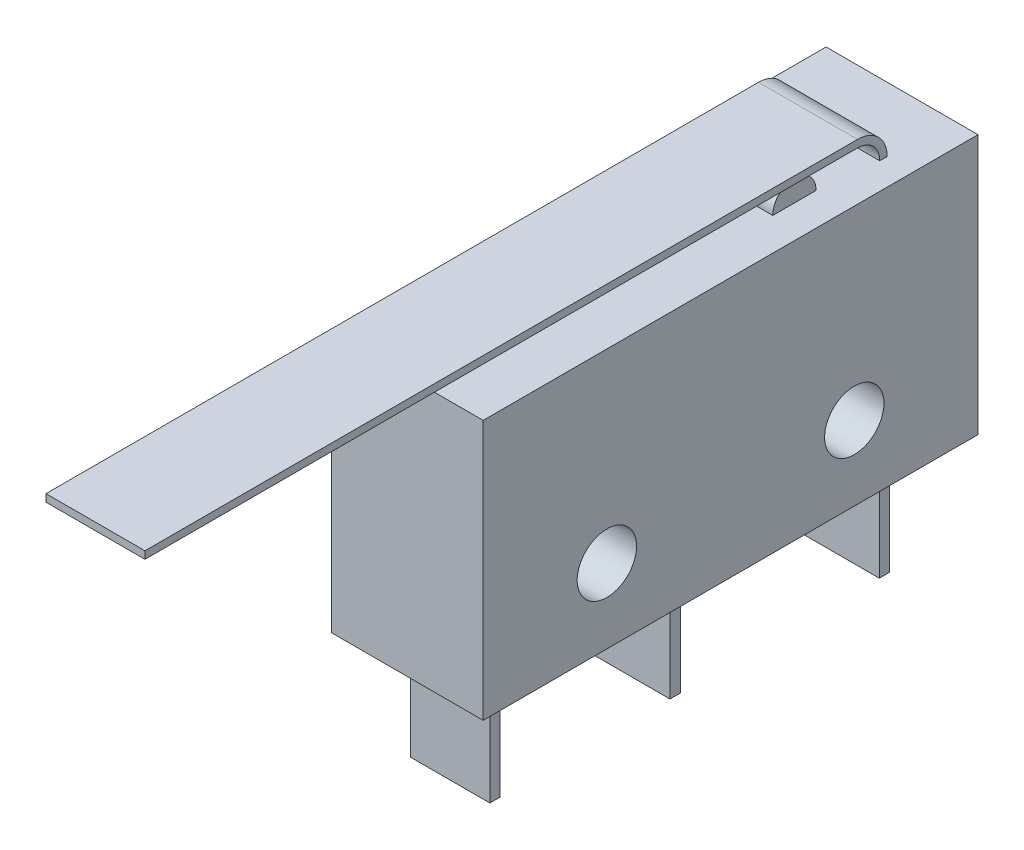
ISO-10303-21;
HEADER;
FILE_DESCRIPTION(('STEP AP214'),'2;1');
FILE_NAME('part.step','',(''),(''),'','','');
FILE_SCHEMA(('AUTOMOTIVE_DESIGN { 1 0 10303 214 1 1 1 1 }'));
ENDSEC;
DATA;
#1=APPLICATION_CONTEXT('core data for automotive mechanical design processes');
#2=APPLICATION_PROTOCOL_DEFINITION('international standard','automotive_design',2000,#1);
#3=PRODUCT_CONTEXT('',#1,'mechanical');
#4=PRODUCT('Part','Part','',(#3));
#5=PRODUCT_RELATED_PRODUCT_CATEGORY('part','',(#4));
#6=PRODUCT_DEFINITION_FORMATION('','',#4);
#7=PRODUCT_DEFINITION_CONTEXT('part definition',#1,'design');
#8=PRODUCT_DEFINITION('design','',#6,#7);
#9=PRODUCT_DEFINITION_SHAPE('','',#8);
#10=(LENGTH_UNIT() NAMED_UNIT(*) SI_UNIT(.MILLI.,.METRE.));
#11=(NAMED_UNIT(*) PLANE_ANGLE_UNIT() SI_UNIT($,.RADIAN.));
#12=(NAMED_UNIT(*) SI_UNIT($,.STERADIAN.) SOLID_ANGLE_UNIT());
#13=UNCERTAINTY_MEASURE_WITH_UNIT(LENGTH_MEASURE(1.E-05),#10,'distance_accuracy_value','');
#14=(GEOMETRIC_REPRESENTATION_CONTEXT(3) GLOBAL_UNCERTAINTY_ASSIGNED_CONTEXT((#13)) GLOBAL_UNIT_ASSIGNED_CONTEXT((#10,
#11,#12)) REPRESENTATION_CONTEXT('',''));
#15=CARTESIAN_POINT('',(0.,0.,0.));
#16=DIRECTION('',(0.,0.,1.));
#17=DIRECTION('',(1.,0.,0.));
#18=AXIS2_PLACEMENT_3D('',#15,#16,#17);
#19=CARTESIAN_POINT('',(6.14,-10.5,0.));
#20=DIRECTION('',(0.,1.,0.));
#21=DIRECTION('',(0.,0.,1.));
#22=AXIS2_PLACEMENT_3D('',#19,#20,#21);
#23=PLANE('',#22);
#24=DIRECTION('',(-1.,0.,0.));
#25=VECTOR('',#24,1.);
#26=CARTESIAN_POINT('',(4.67,-10.5,-17.48));
#27=LINE('',#26,#25);
#28=CARTESIAN_POINT('',(4.67,-10.5,-17.48));
#29=VERTEX_POINT('',#28);
#30=CARTESIAN_POINT('',(1.47,-10.5,-17.48));
#31=VERTEX_POINT('',#30);
#32=EDGE_CURVE('E48',#29,#31,#27,.T.);
#33=ORIENTED_EDGE('',*,*,#32,.F.);
#34=DIRECTION('',(0.,0.,1.));
#35=VECTOR('',#34,1.);
#36=CARTESIAN_POINT('',(4.67,-10.5,-17.48));
#37=LINE('',#36,#35);
#38=CARTESIAN_POINT('',(4.67,-10.5,-17.9));
#39=VERTEX_POINT('',#38);
#40=EDGE_CURVE('E52',#39,#29,#37,.T.);
#41=ORIENTED_EDGE('',*,*,#40,.F.);
#42=DIRECTION('',(-1.,0.,0.));
#43=VECTOR('',#42,1.);
#44=CARTESIAN_POINT('',(4.67,-10.5,-17.9));
#45=LINE('',#44,#43);
#46=CARTESIAN_POINT('',(1.47,-10.5,-17.9));
#47=VERTEX_POINT('',#46);
#48=EDGE_CURVE('E218',#39,#47,#45,.T.);
#49=ORIENTED_EDGE('',*,*,#48,.T.);
#50=DIRECTION('',(0.,0.,1.));
#51=VECTOR('',#50,1.);
#52=CARTESIAN_POINT('',(1.47,-10.5,-17.48));
#53=LINE('',#52,#51);
#54=EDGE_CURVE('E208',#47,#31,#53,.T.);
#55=ORIENTED_EDGE('',*,*,#54,.T.);
#56=EDGE_LOOP('',(#33,#41,#49,#55));
#57=FACE_BOUND('',#56,.T.);
#58=DIRECTION('',(-1.,0.,0.));
#59=VECTOR('',#58,1.);
#60=CARTESIAN_POINT('',(4.67,-10.5,-9.02));
#61=LINE('',#60,#59);
#62=CARTESIAN_POINT('',(4.67,-10.5,-9.02));
#63=VERTEX_POINT('',#62);
#64=CARTESIAN_POINT('',(1.47,-10.5,-9.02));
#65=VERTEX_POINT('',#64);
#66=EDGE_CURVE('E233',#63,#65,#61,.T.);
#67=ORIENTED_EDGE('',*,*,#66,.F.);
#68=DIRECTION('',(0.,0.,1.));
#69=VECTOR('',#68,1.);
#70=CARTESIAN_POINT('',(4.67,-10.5,-9.02));
#71=LINE('',#70,#69);
#72=CARTESIAN_POINT('',(4.67,-10.5,-9.44));
#73=VERTEX_POINT('',#72);
#74=EDGE_CURVE('E231',#73,#63,#71,.T.);
#75=ORIENTED_EDGE('',*,*,#74,.F.);
#76=DIRECTION('',(-1.,0.,0.));
#77=VECTOR('',#76,1.);
#78=CARTESIAN_POINT('',(4.67,-10.5,-9.44));
#79=LINE('',#78,#77);
#80=CARTESIAN_POINT('',(1.47,-10.5,-9.44));
#81=VERTEX_POINT('',#80);
#82=EDGE_CURVE('E242',#73,#81,#79,.T.);
#83=ORIENTED_EDGE('',*,*,#82,.T.);
#84=DIRECTION('',(0.,0.,1.));
#85=VECTOR('',#84,1.);
#86=CARTESIAN_POINT('',(1.47,-10.5,-9.02));
#87=LINE('',#86,#85);
#88=EDGE_CURVE('E226',#81,#65,#87,.T.);
#89=ORIENTED_EDGE('',*,*,#88,.T.);
#90=EDGE_LOOP('',(#67,#75,#83,#89));
#91=FACE_BOUND('',#90,.T.);
#92=DIRECTION('',(0.,0.,-1.));
#93=VECTOR('',#92,1.);
#94=CARTESIAN_POINT('',(0.,-10.5,0.));
#95=LINE('',#94,#93);
#96=CARTESIAN_POINT('',(0.,-10.5,0.));
#97=VERTEX_POINT('',#96);
#98=CARTESIAN_POINT('',(0.,-10.5,-20.0000000000001));
#99=VERTEX_POINT('',#98);
#100=EDGE_CURVE('E366',#97,#99,#95,.T.);
#101=ORIENTED_EDGE('',*,*,#100,.T.);
#102=DIRECTION('',(-1.,0.,0.));
#103=VECTOR('',#102,1.);
#104=CARTESIAN_POINT('',(6.14,-10.5,-20.0000000000001));
#105=LINE('',#104,#103);
#106=CARTESIAN_POINT('',(6.14,-10.5,-20.0000000000001));
#107=VERTEX_POINT('',#106);
#108=EDGE_CURVE('E41',#107,#99,#105,.T.);
#109=ORIENTED_EDGE('',*,*,#108,.F.);
#110=DIRECTION('',(0.,0.,-1.));
#111=VECTOR('',#110,1.);
#112=CARTESIAN_POINT('',(6.14,-10.5,0.));
#113=LINE('',#112,#111);
#114=CARTESIAN_POINT('',(6.14,-10.5,0.));
#115=VERTEX_POINT('',#114);
#116=EDGE_CURVE('E356',#115,#107,#113,.T.);
#117=ORIENTED_EDGE('',*,*,#116,.F.);
#118=DIRECTION('',(-1.,0.,0.));
#119=VECTOR('',#118,1.);
#120=CARTESIAN_POINT('',(6.14,-10.5,0.));
#121=LINE('',#120,#119);
#122=EDGE_CURVE('E11',#115,#97,#121,.T.);
#123=ORIENTED_EDGE('',*,*,#122,.T.);
#124=EDGE_LOOP('',(#101,#109,#117,#123));
#125=FACE_BOUND('',#124,.T.);
#126=DIRECTION('',(0.,0.,1.));
#127=VECTOR('',#126,1.);
#128=CARTESIAN_POINT('',(4.67,-10.5,-2.16));
#129=LINE('',#128,#127);
#130=CARTESIAN_POINT('',(4.67,-10.5,-2.16));
#131=VERTEX_POINT('',#130);
#132=CARTESIAN_POINT('',(4.67,-10.5,-1.74));
#133=VERTEX_POINT('',#132);
#134=EDGE_CURVE('E253',#131,#133,#129,.T.);
#135=ORIENTED_EDGE('',*,*,#134,.F.);
#136=DIRECTION('',(-1.,0.,0.));
#137=VECTOR('',#136,1.);
#138=CARTESIAN_POINT('',(4.67,-10.5,-2.16));
#139=LINE('',#138,#137);
#140=CARTESIAN_POINT('',(1.47,-10.5,-2.16));
#141=VERTEX_POINT('',#140);
#142=EDGE_CURVE('E277',#131,#141,#139,.T.);
#143=ORIENTED_EDGE('',*,*,#142,.T.);
#144=DIRECTION('',(0.,0.,1.));
#145=VECTOR('',#144,1.);
#146=CARTESIAN_POINT('',(1.47,-10.5,-2.16));
#147=LINE('',#146,#145);
#148=CARTESIAN_POINT('',(1.47,-10.5,-1.74));
#149=VERTEX_POINT('',#148);
#150=EDGE_CURVE('E263',#141,#149,#147,.T.);
#151=ORIENTED_EDGE('',*,*,#150,.T.);
#152=DIRECTION('',(-1.,0.,0.));
#153=VECTOR('',#152,1.);
#154=CARTESIAN_POINT('',(4.67,-10.5,-1.74));
#155=LINE('',#154,#153);
#156=EDGE_CURVE('E274',#133,#149,#155,.T.);
#157=ORIENTED_EDGE('',*,*,#156,.F.);
#158=EDGE_LOOP('',(#135,#143,#151,#157));
#159=FACE_BOUND('',#158,.T.);
#160=ADVANCED_FACE('F33',(#57,#91,#125,#159),#23,.F.);
#161=CARTESIAN_POINT('',(6.14,0.,0.));
#162=DIRECTION('',(0.,-1.,0.));
#163=DIRECTION('',(0.,0.,-1.));
#164=AXIS2_PLACEMENT_3D('',#161,#162,#163);
#165=PLANE('',#164);
#166=DIRECTION('',(0.,4.16456098914192E-13,-1.));
#167=VECTOR('',#166,1.);
#168=CARTESIAN_POINT('',(5.07,1.2490009027033E-13,-17.4000000000001));
#169=LINE('',#168,#167);
#170=CARTESIAN_POINT('',(5.07,0.,-17.1));
#171=VERTEX_POINT('',#170);
#172=CARTESIAN_POINT('',(5.07,1.25455054847778E-13,-17.4000000000001));
#173=VERTEX_POINT('',#172);
#174=EDGE_CURVE('E299',#171,#173,#169,.T.);
#175=ORIENTED_EDGE('',*,*,#174,.F.);
#176=DIRECTION('',(-1.,0.,0.));
#177=VECTOR('',#176,1.);
#178=CARTESIAN_POINT('',(5.07,0.,-17.1));
#179=LINE('',#178,#177);
#180=CARTESIAN_POINT('',(1.07,0.,-17.1));
#181=VERTEX_POINT('',#180);
#182=EDGE_CURVE('E337',#171,#181,#179,.T.);
#183=ORIENTED_EDGE('',*,*,#182,.T.);
#184=DIRECTION('',(0.,4.16456098914192E-13,-1.));
#185=VECTOR('',#184,1.);
#186=CARTESIAN_POINT('',(1.07,1.2490009027033E-13,-17.4000000000001));
#187=LINE('',#186,#185);
#188=CARTESIAN_POINT('',(1.07,0.,-17.4000000000001));
#189=VERTEX_POINT('',#188);
#190=EDGE_CURVE('E313',#181,#189,#187,.T.);
#191=ORIENTED_EDGE('',*,*,#190,.T.);
#192=DIRECTION('',(-1.,0.,0.));
#193=VECTOR('',#192,1.);
#194=CARTESIAN_POINT('',(5.07,1.25455054847778E-13,-17.4000000000001));
#195=LINE('',#194,#193);
#196=EDGE_CURVE('E334',#173,#189,#195,.T.);
#197=ORIENTED_EDGE('',*,*,#196,.F.);
#198=EDGE_LOOP('',(#175,#183,#191,#197));
#199=FACE_BOUND('',#198,.T.);
#200=DIRECTION('',(0.,0.,1.));
#201=VECTOR('',#200,1.);
#202=CARTESIAN_POINT('',(0.,0.,0.));
#203=LINE('',#202,#201);
#204=CARTESIAN_POINT('',(0.,0.,-20.0000000000001));
#205=VERTEX_POINT('',#204);
#206=CARTESIAN_POINT('',(0.,0.,0.));
#207=VERTEX_POINT('',#206);
#208=EDGE_CURVE('E357',#205,#207,#203,.T.);
#209=ORIENTED_EDGE('',*,*,#208,.T.);
#210=DIRECTION('',(-1.,0.,0.));
#211=VECTOR('',#210,1.);
#212=CARTESIAN_POINT('',(6.14,0.,0.));
#213=LINE('',#212,#211);
#214=CARTESIAN_POINT('',(6.14,0.,0.));
#215=VERTEX_POINT('',#214);
#216=EDGE_CURVE('E363',#215,#207,#213,.T.);
#217=ORIENTED_EDGE('',*,*,#216,.F.);
#218=DIRECTION('',(0.,0.,1.));
#219=VECTOR('',#218,1.);
#220=CARTESIAN_POINT('',(6.14,0.,0.));
#221=LINE('',#220,#219);
#222=CARTESIAN_POINT('',(6.14,0.,-20.0000000000001));
#223=VERTEX_POINT('',#222);
#224=EDGE_CURVE('E361',#223,#215,#221,.T.);
#225=ORIENTED_EDGE('',*,*,#224,.F.);
#226=DIRECTION('',(-1.,0.,0.));
#227=VECTOR('',#226,1.);
#228=CARTESIAN_POINT('',(6.14,0.,-20.0000000000001));
#229=LINE('',#228,#227);
#230=EDGE_CURVE('E373',#223,#205,#229,.T.);
#231=ORIENTED_EDGE('',*,*,#230,.T.);
#232=EDGE_LOOP('',(#209,#217,#225,#231));
#233=FACE_BOUND('',#232,.T.);
#234=DIRECTION('',(0.,0.,-1.));
#235=VECTOR('',#234,1.);
#236=CARTESIAN_POINT('',(4.82,0.,-13.0250000000001));
#237=LINE('',#236,#235);
#238=CARTESIAN_POINT('',(4.82,0.,-13.0250000000001));
#239=VERTEX_POINT('',#238);
#240=CARTESIAN_POINT('',(4.82,0.,-14.775));
#241=VERTEX_POINT('',#240);
#242=EDGE_CURVE('E283',#239,#241,#237,.T.);
#243=ORIENTED_EDGE('',*,*,#242,.F.);
#244=DIRECTION('',(-1.,0.,0.));
#245=VECTOR('',#244,1.);
#246=CARTESIAN_POINT('',(4.82,0.,-13.0250000000001));
#247=LINE('',#246,#245);
#248=CARTESIAN_POINT('',(1.32,0.,-13.0250000000001));
#249=VERTEX_POINT('',#248);
#250=EDGE_CURVE('E293',#239,#249,#247,.T.);
#251=ORIENTED_EDGE('',*,*,#250,.T.);
#252=DIRECTION('',(0.,0.,-1.));
#253=VECTOR('',#252,1.);
#254=CARTESIAN_POINT('',(1.32,0.,-13.0250000000001));
#255=LINE('',#254,#253);
#256=CARTESIAN_POINT('',(1.32,0.,-14.775));
#257=VERTEX_POINT('',#256);
#258=EDGE_CURVE('E284',#249,#257,#255,.T.);
#259=ORIENTED_EDGE('',*,*,#258,.T.);
#260=DIRECTION('',(-1.,0.,0.));
#261=VECTOR('',#260,1.);
#262=CARTESIAN_POINT('',(4.82,0.,-14.775));
#263=LINE('',#262,#261);
#264=EDGE_CURVE('E286',#241,#257,#263,.T.);
#265=ORIENTED_EDGE('',*,*,#264,.F.);
#266=EDGE_LOOP('',(#243,#251,#259,#265));
#267=FACE_BOUND('',#266,.T.);
#268=ADVANCED_FACE('F390',(#199,#233,#267),#165,.F.);
#269=CARTESIAN_POINT('',(6.14,0.,0.));
#270=DIRECTION('',(1.,0.,0.));
#271=DIRECTION('',(0.,0.,-1.));
#272=AXIS2_PLACEMENT_3D('',#269,#270,#271);
#273=PLANE('',#272);
#274=CARTESIAN_POINT('',(6.14,-7.49999999999989,-5.00000000000012));
#275=DIRECTION('',(1.,0.,0.));
#276=DIRECTION('',(0.,0.,-1.));
#277=AXIS2_PLACEMENT_3D('',#274,#275,#276);
#278=CIRCLE('',#277,1.19999999999998);
#279=CARTESIAN_POINT('',(6.14,-7.49999999999989,-6.20000000000009));
#280=VERTEX_POINT('',#279);
#281=EDGE_CURVE('E347',#280,#280,#278,.T.);
#282=ORIENTED_EDGE('',*,*,#281,.F.);
#283=EDGE_LOOP('',(#282));
#284=FACE_BOUND('',#283,.T.);
#285=DIRECTION('',(0.,-1.,0.));
#286=VECTOR('',#285,1.);
#287=CARTESIAN_POINT('',(6.14,0.,0.));
#288=LINE('',#287,#286);
#289=EDGE_CURVE('E353',#215,#115,#288,.T.);
#290=ORIENTED_EDGE('',*,*,#289,.T.);
#291=ORIENTED_EDGE('',*,*,#116,.T.);
#292=DIRECTION('',(0.,1.,0.));
#293=VECTOR('',#292,1.);
#294=CARTESIAN_POINT('',(6.14,0.,-20.0000000000001));
#295=LINE('',#294,#293);
#296=EDGE_CURVE('E359',#107,#223,#295,.T.);
#297=ORIENTED_EDGE('',*,*,#296,.T.);
#298=ORIENTED_EDGE('',*,*,#224,.T.);
#299=EDGE_LOOP('',(#290,#291,#297,#298));
#300=FACE_BOUND('',#299,.T.);
#301=CARTESIAN_POINT('',(6.14,-7.49999999999993,-15.0000000000001));
#302=DIRECTION('',(1.,0.,0.));
#303=DIRECTION('',(0.,0.,-1.));
#304=AXIS2_PLACEMENT_3D('',#301,#302,#303);
#305=CIRCLE('',#304,1.19999999999998);
#306=CARTESIAN_POINT('',(6.14,-7.49999999999993,-16.2));
#307=VERTEX_POINT('',#306);
#308=EDGE_CURVE('E341',#307,#307,#305,.T.);
#309=ORIENTED_EDGE('',*,*,#308,.F.);
#310=EDGE_LOOP('',(#309));
#311=FACE_BOUND('',#310,.T.);
#312=ADVANCED_FACE('F397',(#284,#300,#311),#273,.T.);
#313=CARTESIAN_POINT('',(0.,0.,0.));
#314=DIRECTION('',(1.,0.,0.));
#315=DIRECTION('',(0.,0.,-1.));
#316=AXIS2_PLACEMENT_3D('',#313,#314,#315);
#317=PLANE('',#316);
#318=DIRECTION('',(0.,-1.,0.));
#319=VECTOR('',#318,1.);
#320=CARTESIAN_POINT('',(0.,0.,0.));
#321=LINE('',#320,#319);
#322=EDGE_CURVE('E350',#207,#97,#321,.T.);
#323=ORIENTED_EDGE('',*,*,#322,.F.);
#324=ORIENTED_EDGE('',*,*,#208,.F.);
#325=DIRECTION('',(0.,1.,0.));
#326=VECTOR('',#325,1.);
#327=CARTESIAN_POINT('',(0.,0.,-20.0000000000001));
#328=LINE('',#327,#326);
#329=EDGE_CURVE('E368',#99,#205,#328,.T.);
#330=ORIENTED_EDGE('',*,*,#329,.F.);
#331=ORIENTED_EDGE('',*,*,#100,.F.);
#332=EDGE_LOOP('',(#323,#324,#330,#331));
#333=FACE_BOUND('',#332,.T.);
#334=CARTESIAN_POINT('',(0.,-7.49999999999989,-5.00000000000012));
#335=DIRECTION('',(1.,0.,0.));
#336=DIRECTION('',(0.,0.,-1.));
#337=AXIS2_PLACEMENT_3D('',#334,#335,#336);
#338=CIRCLE('',#337,1.19999999999998);
#339=CARTESIAN_POINT('',(0.,-7.49999999999989,-6.20000000000009));
#340=VERTEX_POINT('',#339);
#341=EDGE_CURVE('E344',#340,#340,#338,.T.);
#342=ORIENTED_EDGE('',*,*,#341,.T.);
#343=EDGE_LOOP('',(#342));
#344=FACE_BOUND('',#343,.T.);
#345=CARTESIAN_POINT('',(0.,-7.49999999999993,-15.0000000000001));
#346=DIRECTION('',(1.,0.,0.));
#347=DIRECTION('',(0.,0.,-1.));
#348=AXIS2_PLACEMENT_3D('',#345,#346,#347);
#349=CIRCLE('',#348,1.19999999999998);
#350=CARTESIAN_POINT('',(0.,-7.49999999999993,-16.2));
#351=VERTEX_POINT('',#350);
#352=EDGE_CURVE('E340',#351,#351,#349,.T.);
#353=ORIENTED_EDGE('',*,*,#352,.T.);
#354=EDGE_LOOP('',(#353));
#355=FACE_BOUND('',#354,.T.);
#356=ADVANCED_FACE('F386',(#333,#344,#355),#317,.F.);
#357=CARTESIAN_POINT('',(6.14,0.,0.));
#358=DIRECTION('',(0.,0.,-1.));
#359=DIRECTION('',(-1.,0.,0.));
#360=AXIS2_PLACEMENT_3D('',#357,#358,#359);
#361=PLANE('',#360);
#362=ORIENTED_EDGE('',*,*,#322,.T.);
#363=ORIENTED_EDGE('',*,*,#122,.F.);
#364=ORIENTED_EDGE('',*,*,#289,.F.);
#365=ORIENTED_EDGE('',*,*,#216,.T.);
#366=EDGE_LOOP('',(#362,#363,#364,#365));
#367=FACE_BOUND('',#366,.T.);
#368=ADVANCED_FACE('F35',(#367),#361,.F.);
#369=CARTESIAN_POINT('',(6.14,0.,-20.0000000000001));
#370=DIRECTION('',(0.,0.,1.));
#371=DIRECTION('',(1.,0.,0.));
#372=AXIS2_PLACEMENT_3D('',#369,#370,#371);
#373=PLANE('',#372);
#374=ORIENTED_EDGE('',*,*,#329,.T.);
#375=ORIENTED_EDGE('',*,*,#230,.F.);
#376=ORIENTED_EDGE('',*,*,#296,.F.);
#377=ORIENTED_EDGE('',*,*,#108,.T.);
#378=EDGE_LOOP('',(#374,#375,#376,#377));
#379=FACE_BOUND('',#378,.T.);
#380=ADVANCED_FACE('F380',(#379),#373,.F.);
#381=CARTESIAN_POINT('',(6.14,-7.49999999999989,-5.00000000000012));
#382=DIRECTION('',(-1.,0.,0.));
#383=DIRECTION('',(0.,0.,1.));
#384=AXIS2_PLACEMENT_3D('',#381,#382,#383);
#385=CYLINDRICAL_SURFACE('',#384,1.19999999999998);
#386=ORIENTED_EDGE('',*,*,#281,.T.);
#387=EDGE_LOOP('',(#386));
#388=FACE_BOUND('',#387,.T.);
#389=ORIENTED_EDGE('',*,*,#341,.F.);
#390=EDGE_LOOP('',(#389));
#391=FACE_BOUND('',#390,.T.);
#392=ADVANCED_FACE('F482',(#388,#391),#385,.F.);
#393=CARTESIAN_POINT('',(6.14,-7.49999999999993,-15.0000000000001));
#394=DIRECTION('',(-1.,0.,0.));
#395=DIRECTION('',(0.,0.,1.));
#396=AXIS2_PLACEMENT_3D('',#393,#394,#395);
#397=CYLINDRICAL_SURFACE('',#396,1.19999999999998);
#398=ORIENTED_EDGE('',*,*,#308,.T.);
#399=EDGE_LOOP('',(#398));
#400=FACE_BOUND('',#399,.T.);
#401=ORIENTED_EDGE('',*,*,#352,.F.);
#402=EDGE_LOOP('',(#401));
#403=FACE_BOUND('',#402,.T.);
#404=ADVANCED_FACE('F478',(#400,#403),#397,.F.);
#405=CARTESIAN_POINT('',(5.07,0.,-16.2));
#406=DIRECTION('',(-1.,0.,0.));
#407=DIRECTION('',(0.,0.,1.));
#408=AXIS2_PLACEMENT_3D('',#405,#406,#407);
#409=CYLINDRICAL_SURFACE('',#408,0.899999999999944);
#410=CARTESIAN_POINT('',(1.07,0.,-16.2));
#411=DIRECTION('',(-1.,0.,0.));
#412=DIRECTION('',(0.,0.,1.));
#413=AXIS2_PLACEMENT_3D('',#410,#411,#412);
#414=CIRCLE('',#413,0.899999999999944);
#415=CARTESIAN_POINT('',(1.07,0.899999999999937,-16.2));
#416=VERTEX_POINT('',#415);
#417=EDGE_CURVE('E296',#416,#181,#414,.T.);
#418=ORIENTED_EDGE('',*,*,#417,.T.);
#419=ORIENTED_EDGE('',*,*,#182,.F.);
#420=CARTESIAN_POINT('',(5.07,0.,-16.2));
#421=DIRECTION('',(-1.,0.,0.));
#422=DIRECTION('',(0.,0.,1.));
#423=AXIS2_PLACEMENT_3D('',#420,#421,#422);
#424=CIRCLE('',#423,0.899999999999944);
#425=CARTESIAN_POINT('',(5.07,0.899999999999937,-16.2));
#426=VERTEX_POINT('',#425);
#427=EDGE_CURVE('E297',#426,#171,#424,.T.);
#428=ORIENTED_EDGE('',*,*,#427,.F.);
#429=DIRECTION('',(-1.,0.,0.));
#430=VECTOR('',#429,1.);
#431=CARTESIAN_POINT('',(5.07,0.899999999999937,-16.2));
#432=LINE('',#431,#430);
#433=EDGE_CURVE('E310',#426,#416,#432,.T.);
#434=ORIENTED_EDGE('',*,*,#433,.T.);
#435=EDGE_LOOP('',(#418,#419,#428,#434));
#436=FACE_BOUND('',#435,.T.);
#437=ADVANCED_FACE('F474',(#436),#409,.F.);
#438=CARTESIAN_POINT('',(5.07,1.30104260698261E-13,-16.2000000000001));
#439=DIRECTION('',(-1.,0.,0.));
#440=DIRECTION('',(0.,0.,1.));
#441=AXIS2_PLACEMENT_3D('',#438,#439,#440);
#442=CYLINDRICAL_SURFACE('',#441,1.19999999999997);
#443=CARTESIAN_POINT('',(1.07,1.30104260698261E-13,-16.2000000000001));
#444=DIRECTION('',(1.,0.,0.));
#445=DIRECTION('',(0.,0.,1.));
#446=AXIS2_PLACEMENT_3D('',#443,#444,#445);
#447=CIRCLE('',#446,1.19999999999997);
#448=CARTESIAN_POINT('',(1.07,1.2000000000001,-16.2000000000001));
#449=VERTEX_POINT('',#448);
#450=EDGE_CURVE('E316',#189,#449,#447,.T.);
#451=ORIENTED_EDGE('',*,*,#450,.T.);
#452=DIRECTION('',(-1.,0.,0.));
#453=VECTOR('',#452,1.);
#454=CARTESIAN_POINT('',(5.07,1.2000000000001,-16.2000000000001));
#455=LINE('',#454,#453);
#456=CARTESIAN_POINT('',(5.07,1.2000000000001,-16.2000000000001));
#457=VERTEX_POINT('',#456);
#458=EDGE_CURVE('E331',#457,#449,#455,.T.);
#459=ORIENTED_EDGE('',*,*,#458,.F.);
#460=CARTESIAN_POINT('',(5.07,1.30104260698261E-13,-16.2000000000001));
#461=DIRECTION('',(1.,0.,0.));
#462=DIRECTION('',(0.,0.,1.));
#463=AXIS2_PLACEMENT_3D('',#460,#461,#462);
#464=CIRCLE('',#463,1.19999999999997);
#465=EDGE_CURVE('E302',#173,#457,#464,.T.);
#466=ORIENTED_EDGE('',*,*,#465,.F.);
#467=ORIENTED_EDGE('',*,*,#196,.T.);
#468=EDGE_LOOP('',(#451,#459,#466,#467));
#469=FACE_BOUND('',#468,.T.);
#470=ADVANCED_FACE('F470',(#469),#442,.T.);
#471=CARTESIAN_POINT('',(5.07,1.19999999999994,12.6));
#472=DIRECTION('',(0.,-1.,0.));
#473=DIRECTION('',(0.,0.,-1.));
#474=AXIS2_PLACEMENT_3D('',#471,#472,#473);
#475=PLANE('',#474);
#476=DIRECTION('',(0.,0.,1.));
#477=VECTOR('',#476,1.);
#478=CARTESIAN_POINT('',(1.07,1.19999999999994,12.6));
#479=LINE('',#478,#477);
#480=CARTESIAN_POINT('',(1.07,1.19999999999994,12.6));
#481=VERTEX_POINT('',#480);
#482=EDGE_CURVE('E318',#449,#481,#479,.T.);
#483=ORIENTED_EDGE('',*,*,#482,.T.);
#484=DIRECTION('',(-1.,0.,0.));
#485=VECTOR('',#484,1.);
#486=CARTESIAN_POINT('',(5.07,1.19999999999994,12.6));
#487=LINE('',#486,#485);
#488=CARTESIAN_POINT('',(5.07,1.19999999999994,12.6));
#489=VERTEX_POINT('',#488);
#490=EDGE_CURVE('E328',#489,#481,#487,.T.);
#491=ORIENTED_EDGE('',*,*,#490,.F.);
#492=DIRECTION('',(0.,0.,1.));
#493=VECTOR('',#492,1.);
#494=CARTESIAN_POINT('',(5.07,1.19999999999994,12.6));
#495=LINE('',#494,#493);
#496=EDGE_CURVE('E304',#457,#489,#495,.T.);
#497=ORIENTED_EDGE('',*,*,#496,.F.);
#498=ORIENTED_EDGE('',*,*,#458,.T.);
#499=EDGE_LOOP('',(#483,#491,#497,#498));
#500=FACE_BOUND('',#499,.T.);
#501=ADVANCED_FACE('F466',(#500),#475,.F.);
#502=CARTESIAN_POINT('',(5.07,0.899999999999934,12.6));
#503=DIRECTION('',(0.,0.,-1.));
#504=DIRECTION('',(-1.,0.,0.));
#505=AXIS2_PLACEMENT_3D('',#502,#503,#504);
#506=PLANE('',#505);
#507=DIRECTION('',(0.,-1.,0.));
#508=VECTOR('',#507,1.);
#509=CARTESIAN_POINT('',(1.07,0.899999999999934,12.6));
#510=LINE('',#509,#508);
#511=CARTESIAN_POINT('',(1.07,0.899999999999934,12.6));
#512=VERTEX_POINT('',#511);
#513=EDGE_CURVE('E320',#481,#512,#510,.T.);
#514=ORIENTED_EDGE('',*,*,#513,.T.);
#515=DIRECTION('',(-1.,0.,0.));
#516=VECTOR('',#515,1.);
#517=CARTESIAN_POINT('',(5.07,0.899999999999934,12.6));
#518=LINE('',#517,#516);
#519=CARTESIAN_POINT('',(5.07,0.899999999999934,12.6));
#520=VERTEX_POINT('',#519);
#521=EDGE_CURVE('E325',#520,#512,#518,.T.);
#522=ORIENTED_EDGE('',*,*,#521,.F.);
#523=DIRECTION('',(0.,-1.,0.));
#524=VECTOR('',#523,1.);
#525=CARTESIAN_POINT('',(5.07,0.899999999999934,12.6));
#526=LINE('',#525,#524);
#527=EDGE_CURVE('E306',#489,#520,#526,.T.);
#528=ORIENTED_EDGE('',*,*,#527,.F.);
#529=ORIENTED_EDGE('',*,*,#490,.T.);
#530=EDGE_LOOP('',(#514,#522,#528,#529));
#531=FACE_BOUND('',#530,.T.);
#532=ADVANCED_FACE('F462',(#531),#506,.F.);
#533=CARTESIAN_POINT('',(5.07,0.899999999999937,-16.2));
#534=DIRECTION('',(0.,1.,0.));
#535=DIRECTION('',(0.,0.,1.));
#536=AXIS2_PLACEMENT_3D('',#533,#534,#535);
#537=PLANE('',#536);
#538=DIRECTION('',(0.,0.,-1.));
#539=VECTOR('',#538,1.);
#540=CARTESIAN_POINT('',(1.07,0.899999999999937,-16.2));
#541=LINE('',#540,#539);
#542=EDGE_CURVE('E300',#512,#416,#541,.T.);
#543=ORIENTED_EDGE('',*,*,#542,.T.);
#544=ORIENTED_EDGE('',*,*,#433,.F.);
#545=DIRECTION('',(0.,0.,-1.));
#546=VECTOR('',#545,1.);
#547=CARTESIAN_POINT('',(5.07,0.899999999999937,-16.2));
#548=LINE('',#547,#546);
#549=EDGE_CURVE('E308',#520,#426,#548,.T.);
#550=ORIENTED_EDGE('',*,*,#549,.F.);
#551=ORIENTED_EDGE('',*,*,#521,.T.);
#552=EDGE_LOOP('',(#543,#544,#550,#551));
#553=FACE_BOUND('',#552,.T.);
#554=ADVANCED_FACE('F455',(#553),#537,.F.);
#555=CARTESIAN_POINT('',(5.07,0.,-16.2));
#556=DIRECTION('',(-1.,0.,0.));
#557=DIRECTION('',(0.,0.,1.));
#558=AXIS2_PLACEMENT_3D('',#555,#556,#557);
#559=PLANE('',#558);
#560=ORIENTED_EDGE('',*,*,#427,.T.);
#561=ORIENTED_EDGE('',*,*,#174,.T.);
#562=ORIENTED_EDGE('',*,*,#465,.T.);
#563=ORIENTED_EDGE('',*,*,#496,.T.);
#564=ORIENTED_EDGE('',*,*,#527,.T.);
#565=ORIENTED_EDGE('',*,*,#549,.T.);
#566=EDGE_LOOP('',(#560,#561,#562,#563,#564,#565));
#567=FACE_BOUND('',#566,.T.);
#568=ADVANCED_FACE('F452',(#567),#559,.F.);
#569=CARTESIAN_POINT('',(1.07,0.,-16.2));
#570=DIRECTION('',(-1.,0.,0.));
#571=DIRECTION('',(0.,0.,1.));
#572=AXIS2_PLACEMENT_3D('',#569,#570,#571);
#573=PLANE('',#572);
#574=ORIENTED_EDGE('',*,*,#417,.F.);
#575=ORIENTED_EDGE('',*,*,#542,.F.);
#576=ORIENTED_EDGE('',*,*,#513,.F.);
#577=ORIENTED_EDGE('',*,*,#482,.F.);
#578=ORIENTED_EDGE('',*,*,#450,.F.);
#579=ORIENTED_EDGE('',*,*,#190,.F.);
#580=EDGE_LOOP('',(#574,#575,#576,#577,#578,#579));
#581=FACE_BOUND('',#580,.T.);
#582=ADVANCED_FACE('F450',(#581),#573,.T.);
#583=CARTESIAN_POINT('',(4.82,0.,-13.9000000000001));
#584=DIRECTION('',(-1.,0.,0.));
#585=DIRECTION('',(0.,0.,1.));
#586=AXIS2_PLACEMENT_3D('',#583,#584,#585);
#587=CYLINDRICAL_SURFACE('',#586,0.874999999999933);
#588=CARTESIAN_POINT('',(1.32,0.,-13.9000000000001));
#589=DIRECTION('',(1.,0.,0.));
#590=DIRECTION('',(0.,0.,1.));
#591=AXIS2_PLACEMENT_3D('',#588,#589,#590);
#592=CIRCLE('',#591,0.874999999999933);
#593=EDGE_CURVE('E280',#257,#249,#592,.T.);
#594=ORIENTED_EDGE('',*,*,#593,.T.);
#595=ORIENTED_EDGE('',*,*,#250,.F.);
#596=CARTESIAN_POINT('',(4.82,0.,-13.9000000000001));
#597=DIRECTION('',(1.,0.,0.));
#598=DIRECTION('',(0.,0.,1.));
#599=AXIS2_PLACEMENT_3D('',#596,#597,#598);
#600=CIRCLE('',#599,0.874999999999933);
#601=EDGE_CURVE('E281',#241,#239,#600,.T.);
#602=ORIENTED_EDGE('',*,*,#601,.F.);
#603=ORIENTED_EDGE('',*,*,#264,.T.);
#604=EDGE_LOOP('',(#594,#595,#602,#603));
#605=FACE_BOUND('',#604,.T.);
#606=ADVANCED_FACE('F443',(#605),#587,.T.);
#607=CARTESIAN_POINT('',(4.82,0.,-13.9000000000001));
#608=DIRECTION('',(-1.,0.,0.));
#609=DIRECTION('',(0.,0.,1.));
#610=AXIS2_PLACEMENT_3D('',#607,#608,#609);
#611=PLANE('',#610);
#612=ORIENTED_EDGE('',*,*,#601,.T.);
#613=ORIENTED_EDGE('',*,*,#242,.T.);
#614=EDGE_LOOP('',(#612,#613));
#615=FACE_BOUND('',#614,.T.);
#616=ADVANCED_FACE('F440',(#615),#611,.F.);
#617=CARTESIAN_POINT('',(1.32,0.,-13.9000000000001));
#618=DIRECTION('',(-1.,0.,0.));
#619=DIRECTION('',(0.,0.,1.));
#620=AXIS2_PLACEMENT_3D('',#617,#618,#619);
#621=PLANE('',#620);
#622=ORIENTED_EDGE('',*,*,#593,.F.);
#623=ORIENTED_EDGE('',*,*,#258,.F.);
#624=EDGE_LOOP('',(#622,#623));
#625=FACE_BOUND('',#624,.T.);
#626=ADVANCED_FACE('F439',(#625),#621,.T.);
#627=CARTESIAN_POINT('',(4.67,-10.5,-2.16));
#628=DIRECTION('',(0.,0.,1.));
#629=DIRECTION('',(0.,-1.,0.));
#630=AXIS2_PLACEMENT_3D('',#627,#628,#629);
#631=PLANE('',#630);
#632=DIRECTION('',(0.,1.,0.));
#633=VECTOR('',#632,1.);
#634=CARTESIAN_POINT('',(1.47,-10.5,-2.16));
#635=LINE('',#634,#633);
#636=CARTESIAN_POINT('',(1.47,-15.,-2.16));
#637=VERTEX_POINT('',#636);
#638=EDGE_CURVE('E250',#637,#141,#635,.T.);
#639=ORIENTED_EDGE('',*,*,#638,.T.);
#640=ORIENTED_EDGE('',*,*,#142,.F.);
#641=DIRECTION('',(0.,1.,0.));
#642=VECTOR('',#641,1.);
#643=CARTESIAN_POINT('',(4.67,-10.5,-2.16));
#644=LINE('',#643,#642);
#645=CARTESIAN_POINT('',(4.67,-15.,-2.16));
#646=VERTEX_POINT('',#645);
#647=EDGE_CURVE('E251',#646,#131,#644,.T.);
#648=ORIENTED_EDGE('',*,*,#647,.F.);
#649=DIRECTION('',(-1.,0.,0.));
#650=VECTOR('',#649,1.);
#651=CARTESIAN_POINT('',(4.67,-15.,-2.16));
#652=LINE('',#651,#650);
#653=EDGE_CURVE('E260',#646,#637,#652,.T.);
#654=ORIENTED_EDGE('',*,*,#653,.T.);
#655=EDGE_LOOP('',(#639,#640,#648,#654));
#656=FACE_BOUND('',#655,.T.);
#657=ADVANCED_FACE('F418',(#656),#631,.F.);
#658=CARTESIAN_POINT('',(4.67,-10.5,-1.74));
#659=DIRECTION('',(0.,0.,-1.));
#660=DIRECTION('',(0.,1.,0.));
#661=AXIS2_PLACEMENT_3D('',#658,#659,#660);
#662=PLANE('',#661);
#663=DIRECTION('',(0.,-1.,0.));
#664=VECTOR('',#663,1.);
#665=CARTESIAN_POINT('',(1.47,-10.5,-1.74));
#666=LINE('',#665,#664);
#667=CARTESIAN_POINT('',(1.47,-15.,-1.74));
#668=VERTEX_POINT('',#667);
#669=EDGE_CURVE('E266',#149,#668,#666,.T.);
#670=ORIENTED_EDGE('',*,*,#669,.T.);
#671=DIRECTION('',(-1.,0.,0.));
#672=VECTOR('',#671,1.);
#673=CARTESIAN_POINT('',(4.67,-15.,-1.74));
#674=LINE('',#673,#672);
#675=CARTESIAN_POINT('',(4.67,-15.,-1.74));
#676=VERTEX_POINT('',#675);
#677=EDGE_CURVE('E271',#676,#668,#674,.T.);
#678=ORIENTED_EDGE('',*,*,#677,.F.);
#679=DIRECTION('',(0.,-1.,0.));
#680=VECTOR('',#679,1.);
#681=CARTESIAN_POINT('',(4.67,-10.5,-1.74));
#682=LINE('',#681,#680);
#683=EDGE_CURVE('E256',#133,#676,#682,.T.);
#684=ORIENTED_EDGE('',*,*,#683,.F.);
#685=ORIENTED_EDGE('',*,*,#156,.T.);
#686=EDGE_LOOP('',(#670,#678,#684,#685));
#687=FACE_BOUND('',#686,.T.);
#688=ADVANCED_FACE('F410',(#687),#662,.F.);
#689=CARTESIAN_POINT('',(4.67,-15.,-2.16));
#690=DIRECTION('',(0.,1.,0.));
#691=DIRECTION('',(0.,0.,1.));
#692=AXIS2_PLACEMENT_3D('',#689,#690,#691);
#693=PLANE('',#692);
#694=DIRECTION('',(0.,0.,-1.));
#695=VECTOR('',#694,1.);
#696=CARTESIAN_POINT('',(1.47,-15.,-2.16));
#697=LINE('',#696,#695);
#698=EDGE_CURVE('E254',#668,#637,#697,.T.);
#699=ORIENTED_EDGE('',*,*,#698,.T.);
#700=ORIENTED_EDGE('',*,*,#653,.F.);
#701=DIRECTION('',(0.,0.,-1.));
#702=VECTOR('',#701,1.);
#703=CARTESIAN_POINT('',(4.67,-15.,-2.16));
#704=LINE('',#703,#702);
#705=EDGE_CURVE('E258',#676,#646,#704,.T.);
#706=ORIENTED_EDGE('',*,*,#705,.F.);
#707=ORIENTED_EDGE('',*,*,#677,.T.);
#708=EDGE_LOOP('',(#699,#700,#706,#707));
#709=FACE_BOUND('',#708,.T.);
#710=ADVANCED_FACE('F415',(#709),#693,.F.);
#711=CARTESIAN_POINT('',(4.67,0.,0.));
#712=DIRECTION('',(-1.,0.,0.));
#713=DIRECTION('',(0.,0.,1.));
#714=AXIS2_PLACEMENT_3D('',#711,#712,#713);
#715=PLANE('',#714);
#716=ORIENTED_EDGE('',*,*,#647,.T.);
#717=ORIENTED_EDGE('',*,*,#134,.T.);
#718=ORIENTED_EDGE('',*,*,#683,.T.);
#719=ORIENTED_EDGE('',*,*,#705,.T.);
#720=EDGE_LOOP('',(#716,#717,#718,#719));
#721=FACE_BOUND('',#720,.T.);
#722=ADVANCED_FACE('F406',(#721),#715,.F.);
#723=CARTESIAN_POINT('',(1.47,0.,0.));
#724=DIRECTION('',(-1.,0.,0.));
#725=DIRECTION('',(0.,0.,1.));
#726=AXIS2_PLACEMENT_3D('',#723,#724,#725);
#727=PLANE('',#726);
#728=ORIENTED_EDGE('',*,*,#638,.F.);
#729=ORIENTED_EDGE('',*,*,#698,.F.);
#730=ORIENTED_EDGE('',*,*,#669,.F.);
#731=ORIENTED_EDGE('',*,*,#150,.F.);
#732=EDGE_LOOP('',(#728,#729,#730,#731));
#733=FACE_BOUND('',#732,.T.);
#734=ADVANCED_FACE('F420',(#733),#727,.T.);
#735=CARTESIAN_POINT('',(4.67,-10.5,-9.02));
#736=DIRECTION('',(0.,0.,-1.));
#737=DIRECTION('',(-1.,0.,0.));
#738=AXIS2_PLACEMENT_3D('',#735,#736,#737);
#739=PLANE('',#738);
#740=DIRECTION('',(0.,-1.,0.));
#741=VECTOR('',#740,1.);
#742=CARTESIAN_POINT('',(1.47,-10.5,-9.02));
#743=LINE('',#742,#741);
#744=CARTESIAN_POINT('',(1.47,-15.,-9.02));
#745=VERTEX_POINT('',#744);
#746=EDGE_CURVE('E213',#65,#745,#743,.T.);
#747=ORIENTED_EDGE('',*,*,#746,.T.);
#748=DIRECTION('',(-1.,0.,0.));
#749=VECTOR('',#748,1.);
#750=CARTESIAN_POINT('',(4.67,-15.,-9.02));
#751=LINE('',#750,#749);
#752=CARTESIAN_POINT('',(4.67,-15.,-9.02));
#753=VERTEX_POINT('',#752);
#754=EDGE_CURVE('E247',#753,#745,#751,.T.);
#755=ORIENTED_EDGE('',*,*,#754,.F.);
#756=DIRECTION('',(0.,-1.,0.));
#757=VECTOR('',#756,1.);
#758=CARTESIAN_POINT('',(4.67,-10.5,-9.02));
#759=LINE('',#758,#757);
#760=EDGE_CURVE('E222',#63,#753,#759,.T.);
#761=ORIENTED_EDGE('',*,*,#760,.F.);
#762=ORIENTED_EDGE('',*,*,#66,.T.);
#763=EDGE_LOOP('',(#747,#755,#761,#762));
#764=FACE_BOUND('',#763,.T.);
#765=ADVANCED_FACE('F422',(#764),#739,.F.);
#766=CARTESIAN_POINT('',(4.67,-15.,-9.02));
#767=DIRECTION('',(0.,1.,0.));
#768=DIRECTION('',(0.,0.,1.));
#769=AXIS2_PLACEMENT_3D('',#766,#767,#768);
#770=PLANE('',#769);
#771=DIRECTION('',(0.,0.,-1.));
#772=VECTOR('',#771,1.);
#773=CARTESIAN_POINT('',(1.47,-15.,-9.02));
#774=LINE('',#773,#772);
#775=CARTESIAN_POINT('',(1.47,-15.,-9.44));
#776=VERTEX_POINT('',#775);
#777=EDGE_CURVE('E216',#745,#776,#774,.T.);
#778=ORIENTED_EDGE('',*,*,#777,.T.);
#779=DIRECTION('',(-1.,0.,0.));
#780=VECTOR('',#779,1.);
#781=CARTESIAN_POINT('',(4.67,-15.,-9.44));
#782=LINE('',#781,#780);
#783=CARTESIAN_POINT('',(4.67,-15.,-9.44));
#784=VERTEX_POINT('',#783);
#785=EDGE_CURVE('E244',#784,#776,#782,.T.);
#786=ORIENTED_EDGE('',*,*,#785,.F.);
#787=DIRECTION('',(0.,0.,-1.));
#788=VECTOR('',#787,1.);
#789=CARTESIAN_POINT('',(4.67,-15.,-9.02));
#790=LINE('',#789,#788);
#791=EDGE_CURVE('E225',#753,#784,#790,.T.);
#792=ORIENTED_EDGE('',*,*,#791,.F.);
#793=ORIENTED_EDGE('',*,*,#754,.T.);
#794=EDGE_LOOP('',(#778,#786,#792,#793));
#795=FACE_BOUND('',#794,.T.);
#796=ADVANCED_FACE('F428',(#795),#770,.F.);
#797=CARTESIAN_POINT('',(4.67,-10.5,-9.44));
#798=DIRECTION('',(0.,0.,1.));
#799=DIRECTION('',(1.,0.,0.));
#800=AXIS2_PLACEMENT_3D('',#797,#798,#799);
#801=PLANE('',#800);
#802=DIRECTION('',(0.,1.,0.));
#803=VECTOR('',#802,1.);
#804=CARTESIAN_POINT('',(1.47,-10.5,-9.44));
#805=LINE('',#804,#803);
#806=EDGE_CURVE('E236',#776,#81,#805,.T.);
#807=ORIENTED_EDGE('',*,*,#806,.T.);
#808=ORIENTED_EDGE('',*,*,#82,.F.);
#809=DIRECTION('',(0.,1.,0.));
#810=VECTOR('',#809,1.);
#811=CARTESIAN_POINT('',(4.67,-10.5,-9.44));
#812=LINE('',#811,#810);
#813=EDGE_CURVE('E228',#784,#73,#812,.T.);
#814=ORIENTED_EDGE('',*,*,#813,.F.);
#815=ORIENTED_EDGE('',*,*,#785,.T.);
#816=EDGE_LOOP('',(#807,#808,#814,#815));
#817=FACE_BOUND('',#816,.T.);
#818=ADVANCED_FACE('F566',(#817),#801,.F.);
#819=CARTESIAN_POINT('',(4.67,0.,0.));
#820=DIRECTION('',(1.,0.,0.));
#821=DIRECTION('',(0.,0.,-1.));
#822=AXIS2_PLACEMENT_3D('',#819,#820,#821);
#823=PLANE('',#822);
#824=ORIENTED_EDGE('',*,*,#760,.T.);
#825=ORIENTED_EDGE('',*,*,#791,.T.);
#826=ORIENTED_EDGE('',*,*,#813,.T.);
#827=ORIENTED_EDGE('',*,*,#74,.T.);
#828=EDGE_LOOP('',(#824,#825,#826,#827));
#829=FACE_BOUND('',#828,.T.);
#830=ADVANCED_FACE('F576',(#829),#823,.T.);
#831=CARTESIAN_POINT('',(1.47,0.,0.));
#832=DIRECTION('',(1.,0.,0.));
#833=DIRECTION('',(0.,0.,-1.));
#834=AXIS2_PLACEMENT_3D('',#831,#832,#833);
#835=PLANE('',#834);
#836=ORIENTED_EDGE('',*,*,#746,.F.);
#837=ORIENTED_EDGE('',*,*,#88,.F.);
#838=ORIENTED_EDGE('',*,*,#806,.F.);
#839=ORIENTED_EDGE('',*,*,#777,.F.);
#840=EDGE_LOOP('',(#836,#837,#838,#839));
#841=FACE_BOUND('',#840,.T.);
#842=ADVANCED_FACE('F586',(#841),#835,.F.);
#843=CARTESIAN_POINT('',(4.67,-10.5,-17.48));
#844=DIRECTION('',(0.,0.,-1.));
#845=DIRECTION('',(-1.,0.,0.));
#846=AXIS2_PLACEMENT_3D('',#843,#844,#845);
#847=PLANE('',#846);
#848=DIRECTION('',(0.,-1.,0.));
#849=VECTOR('',#848,1.);
#850=CARTESIAN_POINT('',(1.47,-10.5,-17.48));
#851=LINE('',#850,#849);
#852=CARTESIAN_POINT('',(1.47,-15.,-17.48));
#853=VERTEX_POINT('',#852);
#854=EDGE_CURVE('E212',#31,#853,#851,.T.);
#855=ORIENTED_EDGE('',*,*,#854,.T.);
#856=DIRECTION('',(-1.,0.,0.));
#857=VECTOR('',#856,1.);
#858=CARTESIAN_POINT('',(4.67,-15.,-17.48));
#859=LINE('',#858,#857);
#860=CARTESIAN_POINT('',(4.67,-15.,-17.48));
#861=VERTEX_POINT('',#860);
#862=EDGE_CURVE('E196',#861,#853,#859,.T.);
#863=ORIENTED_EDGE('',*,*,#862,.F.);
#864=DIRECTION('',(0.,-1.,0.));
#865=VECTOR('',#864,1.);
#866=CARTESIAN_POINT('',(4.67,-10.5,-17.48));
#867=LINE('',#866,#865);
#868=EDGE_CURVE('E203',#29,#861,#867,.T.);
#869=ORIENTED_EDGE('',*,*,#868,.F.);
#870=ORIENTED_EDGE('',*,*,#32,.T.);
#871=EDGE_LOOP('',(#855,#863,#869,#870));
#872=FACE_BOUND('',#871,.T.);
#873=ADVANCED_FACE('F210',(#872),#847,.F.);
#874=CARTESIAN_POINT('',(4.67,-15.,-17.48));
#875=DIRECTION('',(0.,1.,0.));
#876=DIRECTION('',(0.,0.,1.));
#877=AXIS2_PLACEMENT_3D('',#874,#875,#876);
#878=PLANE('',#877);
#879=DIRECTION('',(0.,0.,-1.));
#880=VECTOR('',#879,1.);
#881=CARTESIAN_POINT('',(1.47,-15.,-17.48));
#882=LINE('',#881,#880);
#883=CARTESIAN_POINT('',(1.47,-15.,-17.9));
#884=VERTEX_POINT('',#883);
#885=EDGE_CURVE('E646',#853,#884,#882,.T.);
#886=ORIENTED_EDGE('',*,*,#885,.T.);
#887=DIRECTION('',(-1.,0.,0.));
#888=VECTOR('',#887,1.);
#889=CARTESIAN_POINT('',(4.67,-15.,-17.9));
#890=LINE('',#889,#888);
#891=CARTESIAN_POINT('',(4.67,-15.,-17.9));
#892=VERTEX_POINT('',#891);
#893=EDGE_CURVE('E199',#892,#884,#890,.T.);
#894=ORIENTED_EDGE('',*,*,#893,.F.);
#895=DIRECTION('',(0.,0.,-1.));
#896=VECTOR('',#895,1.);
#897=CARTESIAN_POINT('',(4.67,-15.,-17.48));
#898=LINE('',#897,#896);
#899=EDGE_CURVE('E192',#861,#892,#898,.T.);
#900=ORIENTED_EDGE('',*,*,#899,.F.);
#901=ORIENTED_EDGE('',*,*,#862,.T.);
#902=EDGE_LOOP('',(#886,#894,#900,#901));
#903=FACE_BOUND('',#902,.T.);
#904=ADVANCED_FACE('F194',(#903),#878,.F.);
#905=CARTESIAN_POINT('',(4.67,-10.5,-17.9));
#906=DIRECTION('',(0.,0.,1.));
#907=DIRECTION('',(1.,0.,0.));
#908=AXIS2_PLACEMENT_3D('',#905,#906,#907);
#909=PLANE('',#908);
#910=DIRECTION('',(0.,1.,0.));
#911=VECTOR('',#910,1.);
#912=CARTESIAN_POINT('',(1.47,-10.5,-17.9));
#913=LINE('',#912,#911);
#914=EDGE_CURVE('E648',#884,#47,#913,.T.);
#915=ORIENTED_EDGE('',*,*,#914,.T.);
#916=ORIENTED_EDGE('',*,*,#48,.F.);
#917=DIRECTION('',(0.,1.,0.));
#918=VECTOR('',#917,1.);
#919=CARTESIAN_POINT('',(4.67,-10.5,-17.9));
#920=LINE('',#919,#918);
#921=EDGE_CURVE('E202',#892,#39,#920,.T.);
#922=ORIENTED_EDGE('',*,*,#921,.F.);
#923=ORIENTED_EDGE('',*,*,#893,.T.);
#924=EDGE_LOOP('',(#915,#916,#922,#923));
#925=FACE_BOUND('',#924,.T.);
#926=ADVANCED_FACE('F613',(#925),#909,.F.);
#927=CARTESIAN_POINT('',(4.67,0.,0.));
#928=DIRECTION('',(1.,0.,0.));
#929=DIRECTION('',(0.,0.,-1.));
#930=AXIS2_PLACEMENT_3D('',#927,#928,#929);
#931=PLANE('',#930);
#932=ORIENTED_EDGE('',*,*,#868,.T.);
#933=ORIENTED_EDGE('',*,*,#899,.T.);
#934=ORIENTED_EDGE('',*,*,#921,.T.);
#935=ORIENTED_EDGE('',*,*,#40,.T.);
#936=EDGE_LOOP('',(#932,#933,#934,#935));
#937=FACE_BOUND('',#936,.T.);
#938=ADVANCED_FACE('F206',(#937),#931,.T.);
#939=CARTESIAN_POINT('',(1.47,0.,0.));
#940=DIRECTION('',(1.,0.,0.));
#941=DIRECTION('',(0.,0.,-1.));
#942=AXIS2_PLACEMENT_3D('',#939,#940,#941);
#943=PLANE('',#942);
#944=ORIENTED_EDGE('',*,*,#854,.F.);
#945=ORIENTED_EDGE('',*,*,#54,.F.);
#946=ORIENTED_EDGE('',*,*,#914,.F.);
#947=ORIENTED_EDGE('',*,*,#885,.F.);
#948=EDGE_LOOP('',(#944,#945,#946,#947));
#949=FACE_BOUND('',#948,.T.);
#950=ADVANCED_FACE('F631',(#949),#943,.F.);
#951=CLOSED_SHELL('',(#160,#268,#312,#356,#368,#380,#392,#404,#437,#470,#501,#532,#554,#568,
#582,#606,#616,#626,#657,#688,#710,#722,#734,#765,#796,#818,#830,#842,#873,#904,#926,#938,#950));
#952=MANIFOLD_SOLID_BREP('B2',#951);
#953=ADVANCED_BREP_SHAPE_REPRESENTATION('',(#18,#952),#14);
#954=SHAPE_DEFINITION_REPRESENTATION(#9,#953);
ENDSEC;
END-ISO-10303-21;
